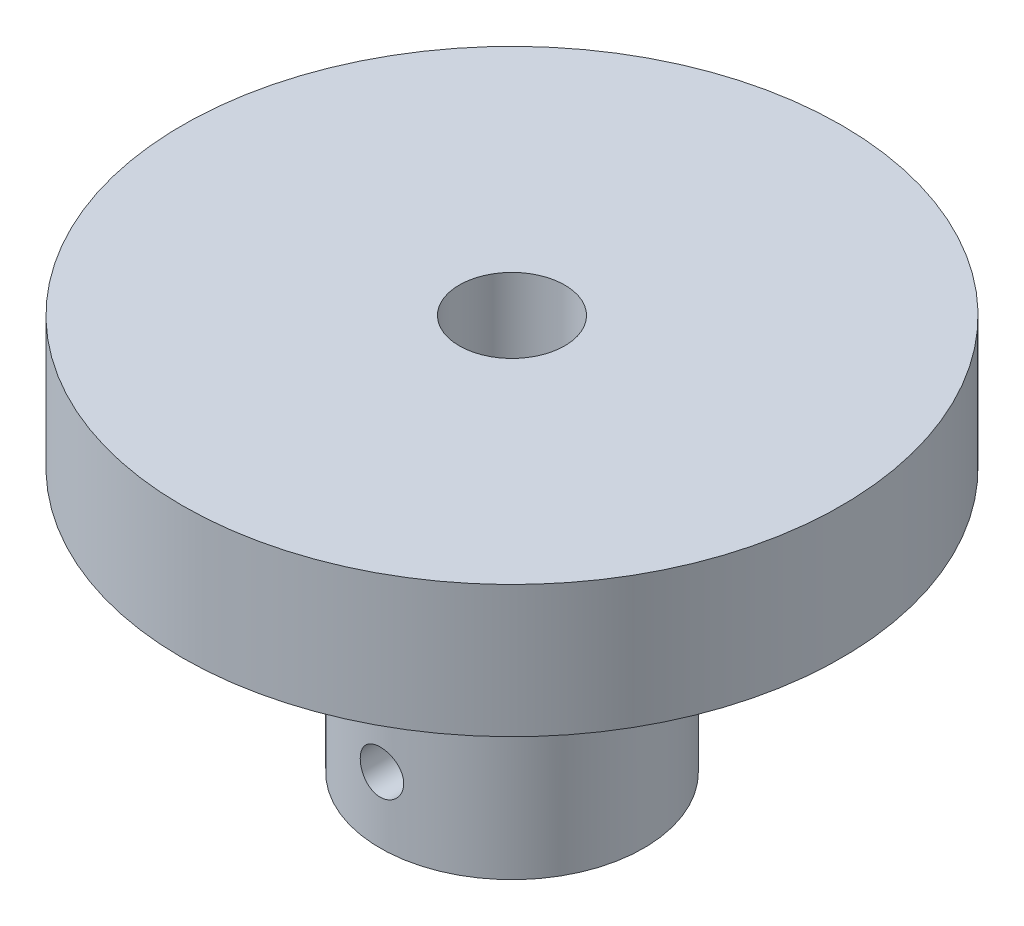
ISO-10303-21;
HEADER;
FILE_DESCRIPTION(('STEP AP214'),'2;1');
FILE_NAME('part.step','',(''),(''),'','','');
FILE_SCHEMA(('AUTOMOTIVE_DESIGN { 1 0 10303 214 1 1 1 1 }'));
ENDSEC;
DATA;
#1=APPLICATION_CONTEXT('core data for automotive mechanical design processes');
#2=APPLICATION_PROTOCOL_DEFINITION('international standard','automotive_design',2000,#1);
#3=PRODUCT_CONTEXT('',#1,'mechanical');
#4=PRODUCT('Part','Part','',(#3));
#5=PRODUCT_RELATED_PRODUCT_CATEGORY('part','',(#4));
#6=PRODUCT_DEFINITION_FORMATION('','',#4);
#7=PRODUCT_DEFINITION_CONTEXT('part definition',#1,'design');
#8=PRODUCT_DEFINITION('design','',#6,#7);
#9=PRODUCT_DEFINITION_SHAPE('','',#8);
#10=(LENGTH_UNIT() NAMED_UNIT(*) SI_UNIT(.MILLI.,.METRE.));
#11=(NAMED_UNIT(*) PLANE_ANGLE_UNIT() SI_UNIT($,.RADIAN.));
#12=(NAMED_UNIT(*) SI_UNIT($,.STERADIAN.) SOLID_ANGLE_UNIT());
#13=UNCERTAINTY_MEASURE_WITH_UNIT(LENGTH_MEASURE(1.E-05),#10,'distance_accuracy_value','');
#14=(GEOMETRIC_REPRESENTATION_CONTEXT(3) GLOBAL_UNCERTAINTY_ASSIGNED_CONTEXT((#13)) GLOBAL_UNIT_ASSIGNED_CONTEXT((#10,
#11,#12)) REPRESENTATION_CONTEXT('',''));
#15=CARTESIAN_POINT('',(0.,0.,0.));
#16=DIRECTION('',(0.,0.,1.));
#17=DIRECTION('',(1.,0.,0.));
#18=AXIS2_PLACEMENT_3D('',#15,#16,#17);
#19=CARTESIAN_POINT('',(0.,0.,0.));
#20=DIRECTION('',(0.,1.,0.));
#21=DIRECTION('',(0.,0.,1.));
#22=AXIS2_PLACEMENT_3D('',#19,#20,#21);
#23=PLANE('',#22);
#24=CARTESIAN_POINT('',(0.,0.,0.));
#25=DIRECTION('',(0.,1.,0.));
#26=DIRECTION('',(0.,0.,1.));
#27=AXIS2_PLACEMENT_3D('',#24,#25,#26);
#28=CIRCLE('',#27,5.);
#29=CARTESIAN_POINT('',(0.,0.,5.));
#30=VERTEX_POINT('',#29);
#31=EDGE_CURVE('E49',#30,#30,#28,.T.);
#32=ORIENTED_EDGE('',*,*,#31,.T.);
#33=EDGE_LOOP('',(#32));
#34=FACE_BOUND('',#33,.T.);
#35=CARTESIAN_POINT('',(0.,0.,0.));
#36=DIRECTION('',(0.,-1.,0.));
#37=DIRECTION('',(0.,0.,-1.));
#38=AXIS2_PLACEMENT_3D('',#35,#36,#37);
#39=CIRCLE('',#38,10.);
#40=CARTESIAN_POINT('',(0.,0.,-10.));
#41=VERTEX_POINT('',#40);
#42=EDGE_CURVE('E63',#41,#41,#39,.T.);
#43=ORIENTED_EDGE('',*,*,#42,.T.);
#44=EDGE_LOOP('',(#43));
#45=FACE_BOUND('',#44,.T.);
#46=ADVANCED_FACE('F38',(#34,#45),#23,.F.);
#47=CARTESIAN_POINT('',(0.,30.,0.));
#48=DIRECTION('',(0.,-1.,0.));
#49=DIRECTION('',(0.,0.,-1.));
#50=AXIS2_PLACEMENT_3D('',#47,#48,#49);
#51=CYLINDRICAL_SURFACE('',#50,25.);
#52=CARTESIAN_POINT('',(0.,20.,0.));
#53=DIRECTION('',(0.,1.,0.));
#54=DIRECTION('',(0.,0.,1.));
#55=AXIS2_PLACEMENT_3D('',#52,#53,#54);
#56=CIRCLE('',#55,25.);
#57=CARTESIAN_POINT('',(0.,20.,25.));
#58=VERTEX_POINT('',#57);
#59=EDGE_CURVE('E59',#58,#58,#56,.T.);
#60=ORIENTED_EDGE('',*,*,#59,.T.);
#61=EDGE_LOOP('',(#60));
#62=FACE_BOUND('',#61,.T.);
#63=CARTESIAN_POINT('',(0.,30.,0.));
#64=DIRECTION('',(0.,1.,0.));
#65=DIRECTION('',(0.,0.,1.));
#66=AXIS2_PLACEMENT_3D('',#63,#64,#65);
#67=CIRCLE('',#66,25.);
#68=CARTESIAN_POINT('',(0.,30.,25.));
#69=VERTEX_POINT('',#68);
#70=EDGE_CURVE('E58',#69,#69,#67,.T.);
#71=ORIENTED_EDGE('',*,*,#70,.F.);
#72=EDGE_LOOP('',(#71));
#73=FACE_BOUND('',#72,.T.);
#74=ADVANCED_FACE('F108',(#62,#73),#51,.T.);
#75=CARTESIAN_POINT('',(0.,30.,0.));
#76=DIRECTION('',(0.,1.,0.));
#77=DIRECTION('',(0.,0.,1.));
#78=AXIS2_PLACEMENT_3D('',#75,#76,#77);
#79=PLANE('',#78);
#80=CARTESIAN_POINT('',(0.,30.,0.));
#81=DIRECTION('',(0.,1.,0.));
#82=DIRECTION('',(0.,0.,1.));
#83=AXIS2_PLACEMENT_3D('',#80,#81,#82);
#84=CIRCLE('',#83,4.);
#85=CARTESIAN_POINT('',(0.,30.,4.));
#86=VERTEX_POINT('',#85);
#87=EDGE_CURVE('E62',#86,#86,#84,.F.);
#88=ORIENTED_EDGE('',*,*,#87,.T.);
#89=EDGE_LOOP('',(#88));
#90=FACE_BOUND('',#89,.T.);
#91=ORIENTED_EDGE('',*,*,#70,.T.);
#92=EDGE_LOOP('',(#91));
#93=FACE_BOUND('',#92,.T.);
#94=ADVANCED_FACE('F104',(#90,#93),#79,.T.);
#95=CARTESIAN_POINT('',(0.,30.001,0.));
#96=DIRECTION('',(0.,-1.,0.));
#97=DIRECTION('',(0.,0.,-1.));
#98=AXIS2_PLACEMENT_3D('',#95,#96,#97);
#99=CYLINDRICAL_SURFACE('',#98,4.);
#100=CARTESIAN_POINT('',(0.,1.,0.));
#101=DIRECTION('',(0.,1.,0.));
#102=DIRECTION('',(0.,0.,1.));
#103=AXIS2_PLACEMENT_3D('',#100,#101,#102);
#104=CIRCLE('',#103,4.);
#105=CARTESIAN_POINT('',(0.,1.,4.));
#106=VERTEX_POINT('',#105);
#107=EDGE_CURVE('E53',#106,#106,#104,.F.);
#108=ORIENTED_EDGE('',*,*,#107,.T.);
#109=EDGE_LOOP('',(#108));
#110=FACE_BOUND('',#109,.T.);
#111=CARTESIAN_POINT('',(-1.64999999999999,5.,3.64383040220041));
#112=CARTESIAN_POINT('',(-1.64999056813102,4.91190351977432,3.64383945275153));
#113=CARTESIAN_POINT('',(-1.64289989177357,4.82365956802641,3.64707173267574));
#114=CARTESIAN_POINT('',(-1.61480845546373,4.64971293892112,3.65959209124688));
#115=CARTESIAN_POINT('',(-1.59376957896339,4.5640178994024,3.66889676295875));
#116=CARTESIAN_POINT('',(-1.53873536249637,4.39799706186937,3.69231325052126));
#117=CARTESIAN_POINT('',(-1.50479212400173,4.31765117978141,3.70640571161012));
#118=CARTESIAN_POINT('',(-1.42506535594206,4.16381823316578,3.73778230052357));
#119=CARTESIAN_POINT('',(-1.37928479159595,4.09032945721597,3.75506562873473));
#120=CARTESIAN_POINT('',(-1.27419856290371,3.9477713121535,3.7920553041855));
#121=CARTESIAN_POINT('',(-1.21428518241359,3.8791707442198,3.81184277704779));
#122=CARTESIAN_POINT('',(-1.08391072165482,3.75264522809124,3.85094363418238));
#123=CARTESIAN_POINT('',(-1.01344563996364,3.69472434852778,3.87025683535296));
#124=CARTESIAN_POINT('',(-0.860301943593378,3.58882862869814,3.90721575035942));
#125=CARTESIAN_POINT('',(-0.777232390113587,3.54137906729385,3.92475616703248));
#126=CARTESIAN_POINT('',(-0.603436361875854,3.4613298546783,3.95520283117798));
#127=CARTESIAN_POINT('',(-0.512713242513042,3.42872373565344,3.96811109652272));
#128=CARTESIAN_POINT('',(-0.331105172304396,3.38097929334378,3.98726403378776));
#129=CARTESIAN_POINT('',(-0.24046562518449,3.36503315207677,3.99381564337609));
#130=CARTESIAN_POINT('',(-0.057576355149864,3.34845334814483,4.0006306156112));
#131=CARTESIAN_POINT('',(0.0346727137709561,3.347813604678,4.00089647540932));
#132=CARTESIAN_POINT('',(0.212297380895986,3.3614364961366,3.99529224160632));
#133=CARTESIAN_POINT('',(0.297754665400397,3.37481218371711,3.98978733384658));
#134=CARTESIAN_POINT('',(0.465085845235279,3.41456881744776,3.97375926025944));
#135=CARTESIAN_POINT('',(0.546959476205492,3.44095072129069,3.96323572489496));
#136=CARTESIAN_POINT('',(0.706295606817228,3.50628766172019,3.93798907731603));
#137=CARTESIAN_POINT('',(0.783671979762468,3.54542798992487,3.92320447216362));
#138=CARTESIAN_POINT('',(0.930960489992464,3.63499127918661,3.89088763760773));
#139=CARTESIAN_POINT('',(1.00086999453932,3.68541820050331,3.87335444442337));
#140=CARTESIAN_POINT('',(1.1363853094704,3.80018823902864,3.83587133640027));
#141=CARTESIAN_POINT('',(1.20135746318645,3.86525341089873,3.8158381454309));
#142=CARTESIAN_POINT('',(1.31973838423493,4.00540966632158,3.77653142784555));
#143=CARTESIAN_POINT('',(1.37314286572201,4.08050444926331,3.75725818494773));
#144=CARTESIAN_POINT('',(1.46845339844827,4.24159840354732,3.7210660715691));
#145=CARTESIAN_POINT('',(1.50994179309276,4.32786757169265,3.70424107982558));
#146=CARTESIAN_POINT('',(1.57754508127095,4.5070466714059,3.67596385006486));
#147=CARTESIAN_POINT('',(1.6036707120612,4.59995191387382,3.66450786071418));
#148=CARTESIAN_POINT('',(1.63821320355941,4.78342289518498,3.64919091711419));
#149=CARTESIAN_POINT('',(1.64765569454681,4.87375830118286,3.64489111171832));
#150=CARTESIAN_POINT('',(1.65157101672826,5.0548056296986,3.64311980380968));
#151=CARTESIAN_POINT('',(1.64604885780401,5.14551741605928,3.6456460160745));
#152=CARTESIAN_POINT('',(1.62112710501826,5.31880100904947,3.65678944366161));
#153=CARTESIAN_POINT('',(1.60261202118542,5.40152817967461,3.66501803861665));
#154=CARTESIAN_POINT('',(1.55339580262014,5.56263706437997,3.68614612916707));
#155=CARTESIAN_POINT('',(1.52269185697122,5.64101777135166,3.69904670212357));
#156=CARTESIAN_POINT('',(1.44853902204984,5.79487900569563,3.72872477858183));
#157=CARTESIAN_POINT('',(1.40460979308263,5.87010019477924,3.74564214050945));
#158=CARTESIAN_POINT('',(1.30573455409451,6.01246016942973,3.78124523189864));
#159=CARTESIAN_POINT('',(1.25078384473683,6.07959548773512,3.79993171387674));
#160=CARTESIAN_POINT('',(1.12627542162098,6.20942962644671,3.83876011670653));
#161=CARTESIAN_POINT('',(1.05590387126703,6.27135173704871,3.85889967217623));
#162=CARTESIAN_POINT('',(0.9052979800801,6.38264285566206,3.89698114804694));
#163=CARTESIAN_POINT('',(0.8250630020269,6.43201105200319,3.91492292631237));
#164=CARTESIAN_POINT('',(0.656516816883264,6.51670413420678,3.94668767391886));
#165=CARTESIAN_POINT('',(0.568191273870489,6.55200347500272,3.96050313975064));
#166=CARTESIAN_POINT('',(0.386140833605175,6.60699165685874,3.98237104121021));
#167=CARTESIAN_POINT('',(0.292419112817559,6.62668958293893,3.9904268305481));
#168=CARTESIAN_POINT('',(0.109187189544835,6.64878822892048,3.9994889299446));
#169=CARTESIAN_POINT('',(0.0198303081186345,6.65228482874193,4.00094173424749));
#170=CARTESIAN_POINT('',(-0.158161739195412,6.64481456562971,3.99786220239438));
#171=CARTESIAN_POINT('',(-0.246797024648479,6.63385015000454,3.99333087896147));
#172=CARTESIAN_POINT('',(-0.417705375935875,6.59855535786443,3.979024148364));
#173=CARTESIAN_POINT('',(-0.50009237162785,6.57469555788544,3.96943363922013));
#174=CARTESIAN_POINT('',(-0.659667355734158,6.51479588512,3.94605480923816));
#175=CARTESIAN_POINT('',(-0.736854343148742,6.47875367521331,3.93226568297163));
#176=CARTESIAN_POINT('',(-0.887661133732616,6.39369547331361,3.90105808483759));
#177=CARTESIAN_POINT('',(-0.960964214361146,6.34416874322707,3.8835042391169));
#178=CARTESIAN_POINT('',(-1.09852932170704,6.23429715321,3.84685709666619));
#179=CARTESIAN_POINT('',(-1.1627880603165,6.17394837691918,3.82776324400832));
#180=CARTESIAN_POINT('',(-1.28487769945046,6.03941247264534,3.78859741195738));
#181=CARTESIAN_POINT('',(-1.34199767947156,5.96457224311506,3.76854475207572));
#182=CARTESIAN_POINT('',(-1.44296474677329,5.80573402431893,3.73105419200534));
#183=CARTESIAN_POINT('',(-1.48680449811903,5.72173100829041,3.7136177396712));
#184=CARTESIAN_POINT('',(-1.55944447766651,5.5472715587301,3.68370387904713));
#185=CARTESIAN_POINT('',(-1.58834112875233,5.4568608919089,3.67119480418034));
#186=CARTESIAN_POINT('',(-1.63017263567572,5.27195285592164,3.65281837075147));
#187=CARTESIAN_POINT('',(-1.64316103312974,5.17747030912313,3.64692873900432));
#188=CARTESIAN_POINT('',(-1.64931209329419,5.05513668635736,3.6441405441978));
#189=CARTESIAN_POINT('',(-1.6500029523216,5.02757556771498,3.64382756923723));
#190=CARTESIAN_POINT('',(-1.64999999999999,5.,3.64383040220041));
#191=B_SPLINE_CURVE_WITH_KNOTS('',3,(#111,#112,#113,#114,#115,#116,#117,#118,#119,#120,#121,
#122,#123,#124,#125,#126,#127,#128,#129,#130,#131,#132,#133,#134,#135,#136,#137,#138,#139,#140,
#141,#142,#143,#144,#145,#146,#147,#148,#149,#150,#151,#152,#153,#154,#155,#156,#157,#158,#159,
#160,#161,#162,#163,#164,#165,#166,#167,#168,#169,#170,#171,#172,#173,#174,#175,#176,#177,#178,
#179,#180,#181,#182,#183,#184,#185,#186,#187,#188,#189,#190),.UNSPECIFIED.,.T.,.F.,(4,2,2,2,2,2,
2,2,2,2,2,2,2,2,2,2,2,2,2,2,2,2,2,2,2,2,2,2,2,2,2,2,2,2,2,2,2,2,2,4),(0.,0.264211724660744,
0.529148459018595,0.793026677872045,1.05683885985755,1.33523297260791,1.61373292676209,
1.90403076094907,2.19420198072698,2.46953816244269,2.74476495901023,3.00356896819765,
3.2623920368679,3.52515526924738,3.78801084539544,4.06907613148063,4.35024537535723,
4.64031806272421,4.93018777241108,5.20152035698261,5.4727621157604,5.72713321026163,
5.98156300028878,6.24665916965706,6.51186861189121,6.79815687284343,7.0844636389886,
7.37128791456167,7.65794504349147,7.92489841526076,8.19180661499931,8.44957452423755,
8.70739191275384,8.97680852354691,9.24632283025303,9.53374725602171,9.82133016535511,
10.1070334851925,10.3917725616093,10.4744749384331),.UNSPECIFIED.);
#192=CARTESIAN_POINT('',(-1.64999999999999,5.,3.64383040220041));
#193=VERTEX_POINT('',#192);
#194=EDGE_CURVE('E133',#193,#193,#191,.T.);
#195=ORIENTED_EDGE('',*,*,#194,.T.);
#196=EDGE_LOOP('',(#195));
#197=FACE_BOUND('',#196,.T.);
#198=CARTESIAN_POINT('',(-1.64999999999999,13.,3.64383040220041));
#199=CARTESIAN_POINT('',(-1.64999056813101,12.9119035197743,3.64383945275153));
#200=CARTESIAN_POINT('',(-1.64289989177357,12.8236595680264,3.64707173267574));
#201=CARTESIAN_POINT('',(-1.61480845546373,12.6497129389211,3.65959209124688));
#202=CARTESIAN_POINT('',(-1.59376957896339,12.5640178994024,3.66889676295875));
#203=CARTESIAN_POINT('',(-1.53873536249637,12.3979970618694,3.69231325052126));
#204=CARTESIAN_POINT('',(-1.50479212400173,12.3176511797814,3.70640571161012));
#205=CARTESIAN_POINT('',(-1.42506535594206,12.1638182331658,3.73778230052357));
#206=CARTESIAN_POINT('',(-1.37928479159595,12.090329457216,3.75506562873473));
#207=CARTESIAN_POINT('',(-1.27419856290371,11.9477713121535,3.7920553041855));
#208=CARTESIAN_POINT('',(-1.21428518241359,11.8791707442198,3.81184277704779));
#209=CARTESIAN_POINT('',(-1.08391072165482,11.7526452280912,3.85094363418238));
#210=CARTESIAN_POINT('',(-1.01344563996364,11.6947243485278,3.87025683535296));
#211=CARTESIAN_POINT('',(-0.860301943593378,11.5888286286981,3.90721575035942));
#212=CARTESIAN_POINT('',(-0.777232390113586,11.5413790672938,3.92475616703248));
#213=CARTESIAN_POINT('',(-0.603436361875853,11.4613298546783,3.95520283117798));
#214=CARTESIAN_POINT('',(-0.512713242513042,11.4287237356534,3.96811109652272));
#215=CARTESIAN_POINT('',(-0.331105172304396,11.3809792933438,3.98726403378776));
#216=CARTESIAN_POINT('',(-0.24046562518449,11.3650331520768,3.99381564337609));
#217=CARTESIAN_POINT('',(-0.0575763551498639,11.3484533481448,4.0006306156112));
#218=CARTESIAN_POINT('',(0.0346727137709561,11.347813604678,4.00089647540932));
#219=CARTESIAN_POINT('',(0.212297380895985,11.3614364961366,3.99529224160632));
#220=CARTESIAN_POINT('',(0.297754665400397,11.3748121837171,3.98978733384658));
#221=CARTESIAN_POINT('',(0.465085845235278,11.4145688174478,3.97375926025944));
#222=CARTESIAN_POINT('',(0.546959476205491,11.4409507212907,3.96323572489496));
#223=CARTESIAN_POINT('',(0.706295606817228,11.5062876617202,3.93798907731603));
#224=CARTESIAN_POINT('',(0.783671979762468,11.5454279899249,3.92320447216362));
#225=CARTESIAN_POINT('',(0.930960489992464,11.6349912791866,3.89088763760773));
#226=CARTESIAN_POINT('',(1.00086999453932,11.6854182005033,3.87335444442337));
#227=CARTESIAN_POINT('',(1.1363853094704,11.8001882390286,3.83587133640027));
#228=CARTESIAN_POINT('',(1.20135746318645,11.8652534108987,3.8158381454309));
#229=CARTESIAN_POINT('',(1.31973838423493,12.0054096663216,3.77653142784555));
#230=CARTESIAN_POINT('',(1.37314286572201,12.0805044492633,3.75725818494773));
#231=CARTESIAN_POINT('',(1.46845339844827,12.2415984035473,3.7210660715691));
#232=CARTESIAN_POINT('',(1.50994179309276,12.3278675716927,3.70424107982558));
#233=CARTESIAN_POINT('',(1.57754508127095,12.5070466714059,3.67596385006486));
#234=CARTESIAN_POINT('',(1.6036707120612,12.5999519138738,3.66450786071418));
#235=CARTESIAN_POINT('',(1.63821320355941,12.783422895185,3.64919091711419));
#236=CARTESIAN_POINT('',(1.64765569454681,12.8737583011829,3.64489111171832));
#237=CARTESIAN_POINT('',(1.65157101672826,13.0548056296986,3.64311980380968));
#238=CARTESIAN_POINT('',(1.64604885780401,13.1455174160593,3.6456460160745));
#239=CARTESIAN_POINT('',(1.62112710501826,13.3188010090495,3.65678944366161));
#240=CARTESIAN_POINT('',(1.60261202118542,13.4015281796746,3.66501803861665));
#241=CARTESIAN_POINT('',(1.55339580262014,13.56263706438,3.68614612916707));
#242=CARTESIAN_POINT('',(1.52269185697122,13.6410177713517,3.69904670212357));
#243=CARTESIAN_POINT('',(1.44853902204984,13.7948790056956,3.72872477858183));
#244=CARTESIAN_POINT('',(1.40460979308263,13.8701001947792,3.74564214050945));
#245=CARTESIAN_POINT('',(1.30573455409451,14.0124601694297,3.78124523189864));
#246=CARTESIAN_POINT('',(1.25078384473683,14.0795954877351,3.79993171387674));
#247=CARTESIAN_POINT('',(1.12627542162098,14.2094296264467,3.83876011670653));
#248=CARTESIAN_POINT('',(1.05590387126703,14.2713517370487,3.85889967217623));
#249=CARTESIAN_POINT('',(0.905297980080097,14.3826428556621,3.89698114804694));
#250=CARTESIAN_POINT('',(0.825063002026898,14.4320110520032,3.91492292631237));
#251=CARTESIAN_POINT('',(0.656516816883262,14.5167041342068,3.94668767391886));
#252=CARTESIAN_POINT('',(0.568191273870487,14.5520034750027,3.96050313975064));
#253=CARTESIAN_POINT('',(0.386140833605174,14.6069916568587,3.98237104121021));
#254=CARTESIAN_POINT('',(0.292419112817558,14.6266895829389,3.9904268305481));
#255=CARTESIAN_POINT('',(0.109187189544834,14.6487882289205,3.9994889299446));
#256=CARTESIAN_POINT('',(0.0198303081186338,14.6522848287419,4.00094173424749));
#257=CARTESIAN_POINT('',(-0.158161739195412,14.6448145656297,3.99786220239438));
#258=CARTESIAN_POINT('',(-0.24679702464848,14.6338501500045,3.99333087896147));
#259=CARTESIAN_POINT('',(-0.417705375935876,14.5985553578644,3.979024148364));
#260=CARTESIAN_POINT('',(-0.500092371627851,14.5746955578854,3.96943363922013));
#261=CARTESIAN_POINT('',(-0.659667355734159,14.51479588512,3.94605480923816));
#262=CARTESIAN_POINT('',(-0.736854343148742,14.4787536752133,3.93226568297163));
#263=CARTESIAN_POINT('',(-0.887661133732616,14.3936954733136,3.90105808483759));
#264=CARTESIAN_POINT('',(-0.960964214361147,14.3441687432271,3.8835042391169));
#265=CARTESIAN_POINT('',(-1.09852932170704,14.23429715321,3.84685709666619));
#266=CARTESIAN_POINT('',(-1.1627880603165,14.1739483769192,3.82776324400832));
#267=CARTESIAN_POINT('',(-1.28487769945046,14.0394124726453,3.78859741195738));
#268=CARTESIAN_POINT('',(-1.34199767947156,13.9645722431151,3.76854475207572));
#269=CARTESIAN_POINT('',(-1.44296474677329,13.8057340243189,3.73105419200534));
#270=CARTESIAN_POINT('',(-1.48680449811903,13.7217310082904,3.7136177396712));
#271=CARTESIAN_POINT('',(-1.55944447766651,13.5472715587301,3.68370387904713));
#272=CARTESIAN_POINT('',(-1.58834112875233,13.4568608919089,3.67119480418034));
#273=CARTESIAN_POINT('',(-1.63017263567572,13.2719528559216,3.65281837075147));
#274=CARTESIAN_POINT('',(-1.64316103312974,13.1774703091231,3.64692873900432));
#275=CARTESIAN_POINT('',(-1.64931209329419,13.0551366863574,3.6441405441978));
#276=CARTESIAN_POINT('',(-1.6500029523216,13.027575567715,3.64382756923723));
#277=CARTESIAN_POINT('',(-1.64999999999999,13.,3.64383040220041));
#278=B_SPLINE_CURVE_WITH_KNOTS('',3,(#198,#199,#200,#201,#202,#203,#204,#205,#206,#207,#208,
#209,#210,#211,#212,#213,#214,#215,#216,#217,#218,#219,#220,#221,#222,#223,#224,#225,#226,#227,
#228,#229,#230,#231,#232,#233,#234,#235,#236,#237,#238,#239,#240,#241,#242,#243,#244,#245,#246,
#247,#248,#249,#250,#251,#252,#253,#254,#255,#256,#257,#258,#259,#260,#261,#262,#263,#264,#265,
#266,#267,#268,#269,#270,#271,#272,#273,#274,#275,#276,#277),.UNSPECIFIED.,.T.,.F.,(4,2,2,2,2,2,
2,2,2,2,2,2,2,2,2,2,2,2,2,2,2,2,2,2,2,2,2,2,2,2,2,2,2,2,2,2,2,2,2,4),(0.,0.264211724660743,
0.529148459018595,0.793026677872045,1.05683885985755,1.33523297260791,1.61373292676209,
1.90403076094907,2.19420198072698,2.46953816244269,2.74476495901023,3.00356896819765,
3.2623920368679,3.52515526924738,3.78801084539544,4.06907613148063,4.35024537535723,
4.64031806272421,4.93018777241108,5.20152035698261,5.4727621157604,5.72713321026163,
5.98156300028878,6.24665916965706,6.51186861189121,6.79815687284344,7.0844636389886,
7.37128791456168,7.65794504349147,7.92489841526076,8.19180661499932,8.44957452423756,
8.70739191275385,8.97680852354691,9.24632283025303,9.53374725602171,9.82133016535512,
10.1070334851925,10.3917725616093,10.4744749384331),.UNSPECIFIED.);
#279=CARTESIAN_POINT('',(-1.64999999999999,13.,3.64383040220041));
#280=VERTEX_POINT('',#279);
#281=EDGE_CURVE('E70',#280,#280,#278,.T.);
#282=ORIENTED_EDGE('',*,*,#281,.T.);
#283=EDGE_LOOP('',(#282));
#284=FACE_BOUND('',#283,.T.);
#285=ORIENTED_EDGE('',*,*,#87,.F.);
#286=EDGE_LOOP('',(#285));
#287=FACE_BOUND('',#286,.T.);
#288=ADVANCED_FACE('F82',(#110,#197,#284,#287),#99,.F.);
#289=CARTESIAN_POINT('',(0.,20.,0.));
#290=DIRECTION('',(0.,1.,0.));
#291=DIRECTION('',(0.,0.,1.));
#292=AXIS2_PLACEMENT_3D('',#289,#290,#291);
#293=PLANE('',#292);
#294=CARTESIAN_POINT('',(0.,20.,0.));
#295=DIRECTION('',(0.,1.,0.));
#296=DIRECTION('',(0.,0.,1.));
#297=AXIS2_PLACEMENT_3D('',#294,#295,#296);
#298=CIRCLE('',#297,12.);
#299=CARTESIAN_POINT('',(0.,20.,12.));
#300=VERTEX_POINT('',#299);
#301=EDGE_CURVE('E12',#300,#300,#298,.T.);
#302=ORIENTED_EDGE('',*,*,#301,.T.);
#303=EDGE_LOOP('',(#302));
#304=FACE_BOUND('',#303,.T.);
#305=ORIENTED_EDGE('',*,*,#59,.F.);
#306=EDGE_LOOP('',(#305));
#307=FACE_BOUND('',#306,.T.);
#308=ADVANCED_FACE('F99',(#304,#307),#293,.F.);
#309=CARTESIAN_POINT('',(0.,101.417784899841,0.));
#310=DIRECTION('',(0.,-1.,0.));
#311=DIRECTION('',(0.,0.,-1.));
#312=AXIS2_PLACEMENT_3D('',#309,#310,#311);
#313=CYLINDRICAL_SURFACE('',#312,10.);
#314=CARTESIAN_POINT('',(0.,18.,0.));
#315=DIRECTION('',(0.,1.,0.));
#316=DIRECTION('',(0.,0.,1.));
#317=AXIS2_PLACEMENT_3D('',#314,#315,#316);
#318=CIRCLE('',#317,10.);
#319=CARTESIAN_POINT('',(0.,18.,10.));
#320=VERTEX_POINT('',#319);
#321=EDGE_CURVE('E45',#320,#320,#318,.F.);
#322=ORIENTED_EDGE('',*,*,#321,.T.);
#323=EDGE_LOOP('',(#322));
#324=FACE_BOUND('',#323,.T.);
#325=CARTESIAN_POINT('',(-1.64999999999999,5.,9.86293566845085));
#326=CARTESIAN_POINT('',(-1.64999629098035,4.90799815763411,9.86293731785559));
#327=CARTESIAN_POINT('',(-1.6422790912311,4.81594574295345,9.86423691212932));
#328=CARTESIAN_POINT('',(-1.61162706431045,4.63442278665812,9.86929026153224));
#329=CARTESIAN_POINT('',(-1.58867811875356,4.54495472085215,9.8730462934991));
#330=CARTESIAN_POINT('',(-1.5282748949929,4.37125382338446,9.88257579035622));
#331=CARTESIAN_POINT('',(-1.49083263568619,4.28701672082335,9.888347583246));
#332=CARTESIAN_POINT('',(-1.40253539774318,4.12602977552741,9.90125628915054));
#333=CARTESIAN_POINT('',(-1.3516819635744,4.04927907203177,9.90839304494647));
#334=CARTESIAN_POINT('',(-1.23748166219591,3.90469249754826,9.92330460813677));
#335=CARTESIAN_POINT('',(-1.17403055174128,3.83693946492918,9.93108439980271));
#336=CARTESIAN_POINT('',(-1.03666129953611,3.71299083427329,9.94636114892746));
#337=CARTESIAN_POINT('',(-0.962742542660851,3.65679591591813,9.95385808973191));
#338=CARTESIAN_POINT('',(-0.806000158090801,3.55724831658916,9.96777711815929));
#339=CARTESIAN_POINT('',(-0.723126989054619,3.51397264811039,9.97419266457576));
#340=CARTESIAN_POINT('',(-0.551164106325251,3.44198691122184,9.98517060701297));
#341=CARTESIAN_POINT('',(-0.462074789289345,3.41327591439407,9.98973312115065));
#342=CARTESIAN_POINT('',(-0.281064093113011,3.37148765336425,9.99645574381605));
#343=CARTESIAN_POINT('',(-0.189175642116501,3.35827125081374,9.99863722113475));
#344=CARTESIAN_POINT('',(-0.00446128175042037,3.34741474747606,10.0004253754509));
#345=CARTESIAN_POINT('',(0.0883645646994422,3.34977360809646,10.0000322241302));
#346=CARTESIAN_POINT('',(0.271367618037818,3.36989202770409,9.9967323508907));
#347=CARTESIAN_POINT('',(0.361561789664352,3.38750185181638,9.99385006818958));
#348=CARTESIAN_POINT('',(0.537697224998583,3.43738661870975,9.98592303427217));
#349=CARTESIAN_POINT('',(0.623638361119396,3.46966200114779,9.98087821822581));
#350=CARTESIAN_POINT('',(0.78927430117936,3.54811098155925,9.96915130593382));
#351=CARTESIAN_POINT('',(0.868939282087189,3.59434641796589,9.96246194992932));
#352=CARTESIAN_POINT('',(1.01943645906903,3.69935776294152,9.9481893971331));
#353=CARTESIAN_POINT('',(1.09026795344527,3.75813466675175,9.94060612942547));
#354=CARTESIAN_POINT('',(1.22197197095425,3.88739135719332,9.92528291081511));
#355=CARTESIAN_POINT('',(1.28271604906533,3.95800199873008,9.9175421690508));
#356=CARTESIAN_POINT('',(1.39151469731539,4.10848050325954,9.90286372793617));
#357=CARTESIAN_POINT('',(1.43956915487057,4.18834844837509,9.89592603571091));
#358=CARTESIAN_POINT('',(1.5216488999909,4.35522179378199,9.88363886477131));
#359=CARTESIAN_POINT('',(1.5556589585636,4.44223481993177,9.87829111185156));
#360=CARTESIAN_POINT('',(1.60854450758026,4.62084660028684,9.86981807463769));
#361=CARTESIAN_POINT('',(1.62742130248434,4.71244495852144,9.8666925987899));
#362=CARTESIAN_POINT('',(1.64932410589817,4.89647869507774,9.86305497953645));
#363=CARTESIAN_POINT('',(1.65253310760669,4.98889171756022,9.86251266770398));
#364=CARTESIAN_POINT('',(1.6434966627856,5.172934586635,9.86402245062659));
#365=CARTESIAN_POINT('',(1.63125180079261,5.26456446271753,9.86607444725293));
#366=CARTESIAN_POINT('',(1.59181115051361,5.44386021319912,9.87251378234871));
#367=CARTESIAN_POINT('',(1.56470830150065,5.53154709960178,9.87688659832881));
#368=CARTESIAN_POINT('',(1.49641841835945,5.70113420759304,9.88746270071878));
#369=CARTESIAN_POINT('',(1.45523055679537,5.78303408887803,9.89366609466455));
#370=CARTESIAN_POINT('',(1.35950711966144,5.93953738917548,9.90727458613197));
#371=CARTESIAN_POINT('',(1.30485415292749,6.01406808987048,9.91469004820881));
#372=CARTESIAN_POINT('',(1.18391324175599,6.15296602506891,9.92985673064713));
#373=CARTESIAN_POINT('',(1.11762449587139,6.21733255890624,9.93760797410877));
#374=CARTESIAN_POINT('',(0.974483484791723,6.33474209808012,9.95266815580003));
#375=CARTESIAN_POINT('',(0.897530542660927,6.38766314576579,9.95997178743297));
#376=CARTESIAN_POINT('',(0.735720107735902,6.47982570565765,9.97322896699239));
#377=CARTESIAN_POINT('',(0.650862866786063,6.51906765351442,9.97918255791273));
#378=CARTESIAN_POINT('',(0.47601685287779,6.5825677643451,9.98904576356827));
#379=CARTESIAN_POINT('',(0.386051879990879,6.60689004529764,9.99296411355053));
#380=CARTESIAN_POINT('',(0.203244410238658,6.64006697360011,9.99835224840596));
#381=CARTESIAN_POINT('',(0.110402145843637,6.64892286725557,9.99982223057197));
#382=CARTESIAN_POINT('',(-0.0743467418035959,6.65088033932714,10.000145298838));
#383=CARTESIAN_POINT('',(-0.166251396930956,6.64416758785561,9.99902922611947));
#384=CARTESIAN_POINT('',(-0.347605270735727,6.61557953808796,9.99436846725468));
#385=CARTESIAN_POINT('',(-0.43705450249768,6.59370432060642,9.99082379405267));
#386=CARTESIAN_POINT('',(-0.610889563964931,6.53548299259324,9.98170266675398));
#387=CARTESIAN_POINT('',(-0.695280700367388,6.49915236494125,9.97612838706588));
#388=CARTESIAN_POINT('',(-0.856798143174382,6.41307208786863,9.96355694814414));
#389=CARTESIAN_POINT('',(-0.933924116084169,6.36332182284739,9.95655972363921));
#390=CARTESIAN_POINT('',(-1.07965789685337,6.25115490006128,9.94181931422729));
#391=CARTESIAN_POINT('',(-1.14816021705335,6.18860215785098,9.93406862876239));
#392=CARTESIAN_POINT('',(-1.27376166628458,6.05289162780783,9.91874715128115));
#393=CARTESIAN_POINT('',(-1.3308581205858,5.97973135938493,9.91117640182652));
#394=CARTESIAN_POINT('',(-1.43238917357862,5.82428217423066,9.8970154548119));
#395=CARTESIAN_POINT('',(-1.47673345800304,5.74193361471933,9.89043240198641));
#396=CARTESIAN_POINT('',(-1.55089189624868,5.57088196298603,9.87907656402569));
#397=CARTESIAN_POINT('',(-1.58072062483371,5.48218534781588,9.87430196413345));
#398=CARTESIAN_POINT('',(-1.61849251524498,5.32761470046375,9.86816715424855));
#399=CARTESIAN_POINT('',(-1.63028895802673,5.26267863497413,9.86621620214801));
#400=CARTESIAN_POINT('',(-1.64604396057965,5.13183702563077,9.86359987952975));
#401=CARTESIAN_POINT('',(-1.65000265800355,5.06593149882397,9.86293448643402));
#402=CARTESIAN_POINT('',(-1.64999999999999,5.,9.86293566845085));
#403=B_SPLINE_CURVE_WITH_KNOTS('',3,(#325,#326,#327,#328,#329,#330,#331,#332,#333,#334,#335,
#336,#337,#338,#339,#340,#341,#342,#343,#344,#345,#346,#347,#348,#349,#350,#351,#352,#353,#354,
#355,#356,#357,#358,#359,#360,#361,#362,#363,#364,#365,#366,#367,#368,#369,#370,#371,#372,#373,
#374,#375,#376,#377,#378,#379,#380,#381,#382,#383,#384,#385,#386,#387,#388,#389,#390,#391,#392,
#393,#394,#395,#396,#397,#398,#399,#400,#401,#402),.UNSPECIFIED.,.T.,.F.,(4,2,2,2,2,2,2,2,2,2,2,
2,2,2,2,2,2,2,2,2,2,2,2,2,2,2,2,2,2,2,2,2,2,2,2,2,2,2,4),(0.,0.275764439202392,
0.551784843546744,0.827576840629569,1.10333709061228,1.38148219258882,1.65964364637685,
1.93943156735329,2.21920165114179,2.49643973106727,2.77365932434102,3.04818762343249,
3.32272415311683,3.59849508924513,3.8742879176082,4.15336037881896,4.43243531591038,
4.71181207725746,4.99116475423997,5.26724677423092,5.54331835183576,5.81768243813564,
6.09206264495275,6.36892529029639,6.64580701282279,6.92550769092012,7.20519946032491,
7.48368066222354,7.76213942263835,8.03729441534005,8.31244794150175,8.58730754656384,
8.86217976243816,9.14014153059553,9.41816840579298,9.69811840194757,9.97778672322847,
10.175411919191,10.3730336442718),.UNSPECIFIED.);
#404=CARTESIAN_POINT('',(-1.64999999999999,5.,9.86293566845085));
#405=VERTEX_POINT('',#404);
#406=EDGE_CURVE('E202',#405,#405,#403,.T.);
#407=ORIENTED_EDGE('',*,*,#406,.F.);
#408=EDGE_LOOP('',(#407));
#409=FACE_BOUND('',#408,.T.);
#410=CARTESIAN_POINT('',(-1.64999999999999,13.,9.86293566845085));
#411=CARTESIAN_POINT('',(-1.64999629098035,12.9079981576341,9.86293731785559));
#412=CARTESIAN_POINT('',(-1.6422790912311,12.8159457429534,9.86423691212932));
#413=CARTESIAN_POINT('',(-1.61162706431045,12.6344227866581,9.86929026153224));
#414=CARTESIAN_POINT('',(-1.58867811875356,12.5449547208522,9.8730462934991));
#415=CARTESIAN_POINT('',(-1.5282748949929,12.3712538233845,9.88257579035622));
#416=CARTESIAN_POINT('',(-1.49083263568619,12.2870167208234,9.888347583246));
#417=CARTESIAN_POINT('',(-1.40253539774319,12.1260297755274,9.90125628915054));
#418=CARTESIAN_POINT('',(-1.3516819635744,12.0492790720318,9.90839304494647));
#419=CARTESIAN_POINT('',(-1.23748166219591,11.9046924975483,9.92330460813677));
#420=CARTESIAN_POINT('',(-1.17403055174128,11.8369394649292,9.93108439980271));
#421=CARTESIAN_POINT('',(-1.03666129953611,11.7129908342733,9.94636114892746));
#422=CARTESIAN_POINT('',(-0.96274254266085,11.6567959159181,9.95385808973191));
#423=CARTESIAN_POINT('',(-0.8060001580908,11.5572483165892,9.96777711815929));
#424=CARTESIAN_POINT('',(-0.723126989054618,11.5139726481104,9.97419266457576));
#425=CARTESIAN_POINT('',(-0.55116410632525,11.4419869112218,9.98517060701297));
#426=CARTESIAN_POINT('',(-0.462074789289344,11.4132759143941,9.98973312115065));
#427=CARTESIAN_POINT('',(-0.281064093113009,11.3714876533643,9.99645574381605));
#428=CARTESIAN_POINT('',(-0.1891756421165,11.3582712508137,9.99863722113475));
#429=CARTESIAN_POINT('',(-0.00446128175041934,11.3474147474761,10.0004253754509));
#430=CARTESIAN_POINT('',(0.0883645646994433,11.3497736080965,10.0000322241302));
#431=CARTESIAN_POINT('',(0.271367618037819,11.3698920277041,9.9967323508907));
#432=CARTESIAN_POINT('',(0.361561789664352,11.3875018518164,9.99385006818958));
#433=CARTESIAN_POINT('',(0.537697224998583,11.4373866187098,9.98592303427217));
#434=CARTESIAN_POINT('',(0.623638361119397,11.4696620011478,9.98087821822581));
#435=CARTESIAN_POINT('',(0.789274301179361,11.5481109815592,9.96915130593382));
#436=CARTESIAN_POINT('',(0.868939282087191,11.5943464179659,9.96246194992932));
#437=CARTESIAN_POINT('',(1.01943645906903,11.6993577629415,9.9481893971331));
#438=CARTESIAN_POINT('',(1.09026795344527,11.7581346667517,9.94060612942547));
#439=CARTESIAN_POINT('',(1.22197197095425,11.8873913571933,9.92528291081511));
#440=CARTESIAN_POINT('',(1.28271604906533,11.9580019987301,9.9175421690508));
#441=CARTESIAN_POINT('',(1.39151469731539,12.1084805032595,9.90286372793617));
#442=CARTESIAN_POINT('',(1.43956915487057,12.1883484483751,9.89592603571091));
#443=CARTESIAN_POINT('',(1.5216488999909,12.355221793782,9.88363886477131));
#444=CARTESIAN_POINT('',(1.5556589585636,12.4422348199318,9.87829111185156));
#445=CARTESIAN_POINT('',(1.60854450758026,12.6208466002868,9.86981807463769));
#446=CARTESIAN_POINT('',(1.62742130248434,12.7124449585214,9.8666925987899));
#447=CARTESIAN_POINT('',(1.64932410589817,12.8964786950777,9.86305497953645));
#448=CARTESIAN_POINT('',(1.65253310760669,12.9888917175602,9.86251266770398));
#449=CARTESIAN_POINT('',(1.6434966627856,13.172934586635,9.86402245062659));
#450=CARTESIAN_POINT('',(1.63125180079261,13.2645644627175,9.86607444725293));
#451=CARTESIAN_POINT('',(1.59181115051361,13.4438602131991,9.87251378234871));
#452=CARTESIAN_POINT('',(1.56470830150065,13.5315470996018,9.87688659832881));
#453=CARTESIAN_POINT('',(1.49641841835945,13.701134207593,9.88746270071878));
#454=CARTESIAN_POINT('',(1.45523055679537,13.783034088878,9.89366609466455));
#455=CARTESIAN_POINT('',(1.35950711966144,13.9395373891755,9.90727458613197));
#456=CARTESIAN_POINT('',(1.30485415292749,14.0140680898705,9.91469004820881));
#457=CARTESIAN_POINT('',(1.18391324175599,14.1529660250689,9.92985673064713));
#458=CARTESIAN_POINT('',(1.11762449587139,14.2173325589062,9.93760797410877));
#459=CARTESIAN_POINT('',(0.974483484791722,14.3347420980801,9.95266815580003));
#460=CARTESIAN_POINT('',(0.897530542660926,14.3876631457658,9.95997178743297));
#461=CARTESIAN_POINT('',(0.7357201077359,14.4798257056577,9.97322896699239));
#462=CARTESIAN_POINT('',(0.650862866786061,14.5190676535144,9.97918255791273));
#463=CARTESIAN_POINT('',(0.476016852877788,14.5825677643451,9.98904576356827));
#464=CARTESIAN_POINT('',(0.386051879990877,14.6068900452976,9.99296411355053));
#465=CARTESIAN_POINT('',(0.203244410238656,14.6400669736001,9.99835224840596));
#466=CARTESIAN_POINT('',(0.110402145843635,14.6489228672556,9.99982223057197));
#467=CARTESIAN_POINT('',(-0.0743467418035983,14.6508803393271,10.000145298838));
#468=CARTESIAN_POINT('',(-0.166251396930959,14.6441675878556,9.99902922611947));
#469=CARTESIAN_POINT('',(-0.347605270735729,14.615579538088,9.99436846725468));
#470=CARTESIAN_POINT('',(-0.437054502497682,14.5937043206064,9.99082379405267));
#471=CARTESIAN_POINT('',(-0.610889563964933,14.5354829925932,9.98170266675398));
#472=CARTESIAN_POINT('',(-0.695280700367389,14.4991523649412,9.97612838706588));
#473=CARTESIAN_POINT('',(-0.856798143174383,14.4130720878686,9.96355694814414));
#474=CARTESIAN_POINT('',(-0.933924116084171,14.3633218228474,9.95655972363921));
#475=CARTESIAN_POINT('',(-1.07965789685337,14.2511549000613,9.94181931422729));
#476=CARTESIAN_POINT('',(-1.14816021705335,14.188602157851,9.93406862876239));
#477=CARTESIAN_POINT('',(-1.27376166628459,14.0528916278078,9.91874715128115));
#478=CARTESIAN_POINT('',(-1.3308581205858,13.9797313593849,9.91117640182652));
#479=CARTESIAN_POINT('',(-1.43238917357862,13.8242821742307,9.8970154548119));
#480=CARTESIAN_POINT('',(-1.47673345800304,13.7419336147193,9.89043240198641));
#481=CARTESIAN_POINT('',(-1.55089189624868,13.570881962986,9.87907656402569));
#482=CARTESIAN_POINT('',(-1.58072062483371,13.4821853478159,9.87430196413345));
#483=CARTESIAN_POINT('',(-1.61849251524498,13.3276147004638,9.86816715424855));
#484=CARTESIAN_POINT('',(-1.63028895802673,13.2626786349741,9.86621620214801));
#485=CARTESIAN_POINT('',(-1.64604396057965,13.1318370256308,9.86359987952975));
#486=CARTESIAN_POINT('',(-1.65000265800355,13.065931498824,9.86293448643402));
#487=CARTESIAN_POINT('',(-1.64999999999999,13.,9.86293566845085));
#488=B_SPLINE_CURVE_WITH_KNOTS('',3,(#410,#411,#412,#413,#414,#415,#416,#417,#418,#419,#420,
#421,#422,#423,#424,#425,#426,#427,#428,#429,#430,#431,#432,#433,#434,#435,#436,#437,#438,#439,
#440,#441,#442,#443,#444,#445,#446,#447,#448,#449,#450,#451,#452,#453,#454,#455,#456,#457,#458,
#459,#460,#461,#462,#463,#464,#465,#466,#467,#468,#469,#470,#471,#472,#473,#474,#475,#476,#477,
#478,#479,#480,#481,#482,#483,#484,#485,#486,#487),.UNSPECIFIED.,.T.,.F.,(4,2,2,2,2,2,2,2,2,2,2,
2,2,2,2,2,2,2,2,2,2,2,2,2,2,2,2,2,2,2,2,2,2,2,2,2,2,2,4),(0.,0.275764439202392,
0.551784843546744,0.827576840629568,1.10333709061228,1.38148219258882,1.65964364637685,
1.93943156735329,2.21920165114179,2.49643973106727,2.77365932434102,3.04818762343249,
3.32272415311683,3.59849508924514,3.8742879176082,4.15336037881896,4.43243531591038,
4.71181207725746,4.99116475423997,5.26724677423092,5.54331835183576,5.81768243813564,
6.09206264495275,6.36892529029639,6.64580701282279,6.92550769092012,7.20519946032491,
7.48368066222354,7.76213942263835,8.03729441534006,8.31244794150175,8.58730754656385,
8.86217976243816,9.14014153059553,9.41816840579299,9.69811840194758,9.97778672322847,
10.175411919191,10.3730336442718),.UNSPECIFIED.);
#489=CARTESIAN_POINT('',(-1.64999999999999,13.,9.86293566845085));
#490=VERTEX_POINT('',#489);
#491=EDGE_CURVE('E77',#490,#490,#488,.T.);
#492=ORIENTED_EDGE('',*,*,#491,.F.);
#493=EDGE_LOOP('',(#492));
#494=FACE_BOUND('',#493,.T.);
#495=ORIENTED_EDGE('',*,*,#42,.F.);
#496=EDGE_LOOP('',(#495));
#497=FACE_BOUND('',#496,.T.);
#498=ADVANCED_FACE('F91',(#324,#409,#494,#497),#313,.T.);
#499=CARTESIAN_POINT('',(0.,13.,0.));
#500=DIRECTION('',(0.,0.,-1.));
#501=DIRECTION('',(-1.,0.,0.));
#502=AXIS2_PLACEMENT_3D('',#499,#500,#501);
#503=CYLINDRICAL_SURFACE('',#502,1.64999999999999);
#504=ORIENTED_EDGE('',*,*,#491,.T.);
#505=EDGE_LOOP('',(#504));
#506=FACE_BOUND('',#505,.T.);
#507=ORIENTED_EDGE('',*,*,#281,.F.);
#508=EDGE_LOOP('',(#507));
#509=FACE_BOUND('',#508,.T.);
#510=ADVANCED_FACE('F86',(#506,#509),#503,.F.);
#511=CARTESIAN_POINT('',(0.,5.,0.));
#512=DIRECTION('',(0.,0.,-1.));
#513=DIRECTION('',(-1.,0.,0.));
#514=AXIS2_PLACEMENT_3D('',#511,#512,#513);
#515=CYLINDRICAL_SURFACE('',#514,1.64999999999999);
#516=ORIENTED_EDGE('',*,*,#406,.T.);
#517=EDGE_LOOP('',(#516));
#518=FACE_BOUND('',#517,.T.);
#519=ORIENTED_EDGE('',*,*,#194,.F.);
#520=EDGE_LOOP('',(#519));
#521=FACE_BOUND('',#520,.T.);
#522=ADVANCED_FACE('F90',(#518,#521),#515,.F.);
#523=CARTESIAN_POINT('',(0.,1.,0.));
#524=DIRECTION('',(0.,-1.,0.));
#525=DIRECTION('',(0.,0.,-1.));
#526=AXIS2_PLACEMENT_3D('',#523,#524,#525);
#527=CONICAL_SURFACE('',#526,4.,0.785398163397448);
#528=ORIENTED_EDGE('',*,*,#31,.F.);
#529=EDGE_LOOP('',(#528));
#530=FACE_BOUND('',#529,.T.);
#531=ORIENTED_EDGE('',*,*,#107,.F.);
#532=EDGE_LOOP('',(#531));
#533=FACE_BOUND('',#532,.T.);
#534=ADVANCED_FACE('F117',(#530,#533),#527,.F.);
#535=CARTESIAN_POINT('',(0.,18.,0.));
#536=DIRECTION('',(0.,1.,0.));
#537=DIRECTION('',(0.,0.,1.));
#538=AXIS2_PLACEMENT_3D('',#535,#536,#537);
#539=TOROIDAL_SURFACE('',#538,12.,2.);
#540=ORIENTED_EDGE('',*,*,#301,.F.);
#541=EDGE_LOOP('',(#540));
#542=FACE_BOUND('',#541,.T.);
#543=ORIENTED_EDGE('',*,*,#321,.F.);
#544=EDGE_LOOP('',(#543));
#545=FACE_BOUND('',#544,.T.);
#546=ADVANCED_FACE('F40',(#542,#545),#539,.F.);
#547=CLOSED_SHELL('',(#46,#74,#94,#288,#308,#498,#510,#522,#534,#546));
#548=MANIFOLD_SOLID_BREP('B2',#547);
#549=ADVANCED_BREP_SHAPE_REPRESENTATION('',(#18,#548),#14);
#550=SHAPE_DEFINITION_REPRESENTATION(#9,#549);
ENDSEC;
END-ISO-10303-21;
